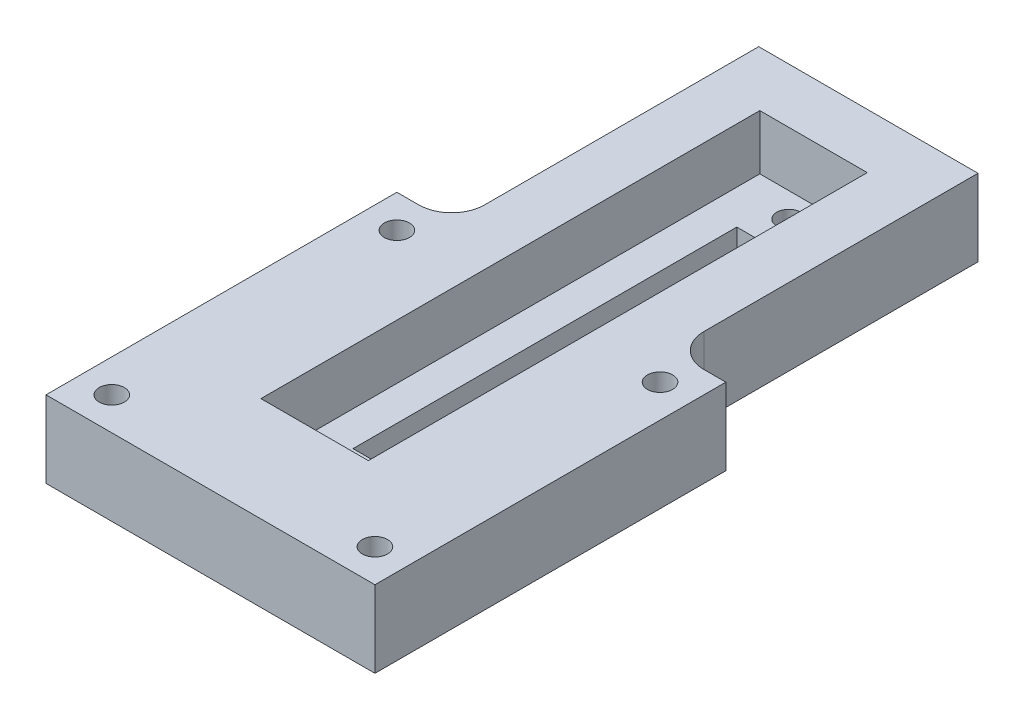
ISO-10303-21;
HEADER;
FILE_DESCRIPTION(('STEP AP214'),'2;1');
FILE_NAME('part.step','',(''),(''),'','','');
FILE_SCHEMA(('AUTOMOTIVE_DESIGN { 1 0 10303 214 1 1 1 1 }'));
ENDSEC;
DATA;
#1=APPLICATION_CONTEXT('core data for automotive mechanical design processes');
#2=APPLICATION_PROTOCOL_DEFINITION('international standard','automotive_design',2000,#1);
#3=PRODUCT_CONTEXT('',#1,'mechanical');
#4=PRODUCT('Part','Part','',(#3));
#5=PRODUCT_RELATED_PRODUCT_CATEGORY('part','',(#4));
#6=PRODUCT_DEFINITION_FORMATION('','',#4);
#7=PRODUCT_DEFINITION_CONTEXT('part definition',#1,'design');
#8=PRODUCT_DEFINITION('design','',#6,#7);
#9=PRODUCT_DEFINITION_SHAPE('','',#8);
#10=(LENGTH_UNIT() NAMED_UNIT(*) SI_UNIT(.MILLI.,.METRE.));
#11=(NAMED_UNIT(*) PLANE_ANGLE_UNIT() SI_UNIT($,.RADIAN.));
#12=(NAMED_UNIT(*) SI_UNIT($,.STERADIAN.) SOLID_ANGLE_UNIT());
#13=UNCERTAINTY_MEASURE_WITH_UNIT(LENGTH_MEASURE(1.E-05),#10,'distance_accuracy_value','');
#14=(GEOMETRIC_REPRESENTATION_CONTEXT(3) GLOBAL_UNCERTAINTY_ASSIGNED_CONTEXT((#13)) GLOBAL_UNIT_ASSIGNED_CONTEXT((#10,
#11,#12)) REPRESENTATION_CONTEXT('',''));
#15=CARTESIAN_POINT('',(0.,0.,0.));
#16=DIRECTION('',(0.,0.,1.));
#17=DIRECTION('',(1.,0.,0.));
#18=AXIS2_PLACEMENT_3D('',#15,#16,#17);
#19=CARTESIAN_POINT('',(0.,0.,18.25));
#20=DIRECTION('',(0.,1.,0.));
#21=DIRECTION('',(0.,0.,1.));
#22=AXIS2_PLACEMENT_3D('',#19,#20,#21);
#23=CYLINDRICAL_SURFACE('',#22,1.1);
#24=CARTESIAN_POINT('',(0.,2.,18.25));
#25=DIRECTION('',(0.,1.,0.));
#26=DIRECTION('',(0.,0.,-1.));
#27=AXIS2_PLACEMENT_3D('',#24,#25,#26);
#28=CIRCLE('',#27,1.1);
#29=CARTESIAN_POINT('',(0.,2.,17.15));
#30=VERTEX_POINT('',#29);
#31=EDGE_CURVE('E193',#30,#30,#28,.T.);
#32=ORIENTED_EDGE('',*,*,#31,.T.);
#33=EDGE_LOOP('',(#32));
#34=FACE_BOUND('',#33,.T.);
#35=CARTESIAN_POINT('',(0.,1.,18.25));
#36=DIRECTION('',(0.,-1.,0.));
#37=DIRECTION('',(0.,0.,-1.));
#38=AXIS2_PLACEMENT_3D('',#35,#36,#37);
#39=CIRCLE('',#38,1.1);
#40=CARTESIAN_POINT('',(0.,1.,17.15));
#41=VERTEX_POINT('',#40);
#42=EDGE_CURVE('E39',#41,#41,#39,.F.);
#43=ORIENTED_EDGE('',*,*,#42,.F.);
#44=EDGE_LOOP('',(#43));
#45=FACE_BOUND('',#44,.T.);
#46=ADVANCED_FACE('F35',(#34,#45),#23,.F.);
#47=CARTESIAN_POINT('',(0.,0.,-22.75));
#48=DIRECTION('',(0.,1.,0.));
#49=DIRECTION('',(0.,0.,1.));
#50=AXIS2_PLACEMENT_3D('',#47,#48,#49);
#51=CYLINDRICAL_SURFACE('',#50,1.1);
#52=CARTESIAN_POINT('',(0.,2.,-22.75));
#53=DIRECTION('',(0.,1.,0.));
#54=DIRECTION('',(0.,0.,1.));
#55=AXIS2_PLACEMENT_3D('',#52,#53,#54);
#56=CIRCLE('',#55,1.1);
#57=CARTESIAN_POINT('',(0.,2.,-21.65));
#58=VERTEX_POINT('',#57);
#59=EDGE_CURVE('E200',#58,#58,#56,.T.);
#60=ORIENTED_EDGE('',*,*,#59,.T.);
#61=EDGE_LOOP('',(#60));
#62=FACE_BOUND('',#61,.T.);
#63=CARTESIAN_POINT('',(0.,1.,-22.75));
#64=DIRECTION('',(0.,-1.,0.));
#65=DIRECTION('',(0.,0.,-1.));
#66=AXIS2_PLACEMENT_3D('',#63,#64,#65);
#67=CIRCLE('',#66,1.1);
#68=CARTESIAN_POINT('',(0.,1.,-23.85));
#69=VERTEX_POINT('',#68);
#70=EDGE_CURVE('E306',#69,#69,#67,.F.);
#71=ORIENTED_EDGE('',*,*,#70,.F.);
#72=EDGE_LOOP('',(#71));
#73=FACE_BOUND('',#72,.T.);
#74=ADVANCED_FACE('F361',(#62,#73),#51,.F.);
#75=CARTESIAN_POINT('',(0.,2.,0.));
#76=DIRECTION('',(0.,-1.,0.));
#77=DIRECTION('',(0.,0.,-1.));
#78=AXIS2_PLACEMENT_3D('',#75,#76,#77);
#79=PLANE('',#78);
#80=ORIENTED_EDGE('',*,*,#59,.F.);
#81=EDGE_LOOP('',(#80));
#82=FACE_BOUND('',#81,.T.);
#83=ORIENTED_EDGE('',*,*,#31,.F.);
#84=EDGE_LOOP('',(#83));
#85=FACE_BOUND('',#84,.T.);
#86=DIRECTION('',(0.,0.,-1.));
#87=VECTOR('',#86,1.);
#88=CARTESIAN_POINT('',(4.9,2.,20.5));
#89=LINE('',#88,#87);
#90=CARTESIAN_POINT('',(4.9,2.,20.5));
#91=VERTEX_POINT('',#90);
#92=CARTESIAN_POINT('',(4.9,2.,-25.));
#93=VERTEX_POINT('',#92);
#94=EDGE_CURVE('E210',#91,#93,#89,.T.);
#95=ORIENTED_EDGE('',*,*,#94,.T.);
#96=DIRECTION('',(-1.,0.,0.));
#97=VECTOR('',#96,1.);
#98=CARTESIAN_POINT('',(-4.9,2.,-25.));
#99=LINE('',#98,#97);
#100=CARTESIAN_POINT('',(-4.9,2.,-25.));
#101=VERTEX_POINT('',#100);
#102=EDGE_CURVE('E213',#93,#101,#99,.T.);
#103=ORIENTED_EDGE('',*,*,#102,.T.);
#104=DIRECTION('',(0.,0.,1.));
#105=VECTOR('',#104,1.);
#106=CARTESIAN_POINT('',(-4.9,2.,20.5));
#107=LINE('',#106,#105);
#108=CARTESIAN_POINT('',(-4.9,2.,20.5));
#109=VERTEX_POINT('',#108);
#110=EDGE_CURVE('E217',#101,#109,#107,.T.);
#111=ORIENTED_EDGE('',*,*,#110,.T.);
#112=DIRECTION('',(1.,0.,0.));
#113=VECTOR('',#112,1.);
#114=CARTESIAN_POINT('',(-4.9,2.,20.5));
#115=LINE('',#114,#113);
#116=EDGE_CURVE('E220',#109,#91,#115,.T.);
#117=ORIENTED_EDGE('',*,*,#116,.T.);
#118=EDGE_LOOP('',(#95,#103,#111,#117));
#119=FACE_BOUND('',#118,.T.);
#120=DIRECTION('',(0.,0.,-1.));
#121=VECTOR('',#120,1.);
#122=CARTESIAN_POINT('',(1.75,2.,15.25));
#123=LINE('',#122,#121);
#124=CARTESIAN_POINT('',(1.75,2.,15.25));
#125=VERTEX_POINT('',#124);
#126=CARTESIAN_POINT('',(1.75,2.,-19.75));
#127=VERTEX_POINT('',#126);
#128=EDGE_CURVE('E169',#125,#127,#123,.T.);
#129=ORIENTED_EDGE('',*,*,#128,.F.);
#130=DIRECTION('',(1.,0.,0.));
#131=VECTOR('',#130,1.);
#132=CARTESIAN_POINT('',(-1.75,2.,15.25));
#133=LINE('',#132,#131);
#134=CARTESIAN_POINT('',(-1.75,2.,15.25));
#135=VERTEX_POINT('',#134);
#136=EDGE_CURVE('E187',#135,#125,#133,.T.);
#137=ORIENTED_EDGE('',*,*,#136,.F.);
#138=DIRECTION('',(0.,0.,1.));
#139=VECTOR('',#138,1.);
#140=CARTESIAN_POINT('',(-1.75,2.,15.25));
#141=LINE('',#140,#139);
#142=CARTESIAN_POINT('',(-1.75,2.,-19.75));
#143=VERTEX_POINT('',#142);
#144=EDGE_CURVE('E190',#143,#135,#141,.T.);
#145=ORIENTED_EDGE('',*,*,#144,.F.);
#146=DIRECTION('',(-1.,0.,0.));
#147=VECTOR('',#146,1.);
#148=CARTESIAN_POINT('',(-1.75,2.,-19.75));
#149=LINE('',#148,#147);
#150=EDGE_CURVE('E199',#127,#143,#149,.T.);
#151=ORIENTED_EDGE('',*,*,#150,.F.);
#152=EDGE_LOOP('',(#129,#137,#145,#151));
#153=FACE_BOUND('',#152,.T.);
#154=ADVANCED_FACE('F357',(#82,#85,#119,#153),#79,.F.);
#155=CARTESIAN_POINT('',(10.,7.,30.));
#156=DIRECTION('',(-1.,0.,0.));
#157=DIRECTION('',(0.,0.,1.));
#158=AXIS2_PLACEMENT_3D('',#155,#156,#157);
#159=PLANE('',#158);
#160=DIRECTION('',(0.,0.,-1.));
#161=VECTOR('',#160,1.);
#162=CARTESIAN_POINT('',(10.,7.,30.));
#163=LINE('',#162,#161);
#164=CARTESIAN_POINT('',(10.,7.,-5.));
#165=VERTEX_POINT('',#164);
#166=CARTESIAN_POINT('',(10.,7.,-30.));
#167=VERTEX_POINT('',#166);
#168=EDGE_CURVE('E271',#165,#167,#163,.T.);
#169=ORIENTED_EDGE('',*,*,#168,.F.);
#170=DIRECTION('',(0.,-1.,0.));
#171=VECTOR('',#170,1.);
#172=CARTESIAN_POINT('',(10.,7.,-5.));
#173=LINE('',#172,#171);
#174=CARTESIAN_POINT('',(10.,0.,-5.));
#175=VERTEX_POINT('',#174);
#176=EDGE_CURVE('E293',#165,#175,#173,.T.);
#177=ORIENTED_EDGE('',*,*,#176,.T.);
#178=DIRECTION('',(0.,0.,-1.));
#179=VECTOR('',#178,1.);
#180=CARTESIAN_POINT('',(10.,0.,30.));
#181=LINE('',#180,#179);
#182=CARTESIAN_POINT('',(10.,0.,-30.));
#183=VERTEX_POINT('',#182);
#184=EDGE_CURVE('E263',#175,#183,#181,.T.);
#185=ORIENTED_EDGE('',*,*,#184,.T.);
#186=DIRECTION('',(0.,-1.,0.));
#187=VECTOR('',#186,1.);
#188=CARTESIAN_POINT('',(10.,7.,-30.));
#189=LINE('',#188,#187);
#190=EDGE_CURVE('E290',#167,#183,#189,.T.);
#191=ORIENTED_EDGE('',*,*,#190,.F.);
#192=EDGE_LOOP('',(#169,#177,#185,#191));
#193=FACE_BOUND('',#192,.T.);
#194=ADVANCED_FACE('F360',(#193),#159,.F.);
#195=CARTESIAN_POINT('',(-10.,7.,-30.));
#196=DIRECTION('',(0.,0.,1.));
#197=DIRECTION('',(1.,0.,0.));
#198=AXIS2_PLACEMENT_3D('',#195,#196,#197);
#199=PLANE('',#198);
#200=DIRECTION('',(-1.,0.,0.));
#201=VECTOR('',#200,1.);
#202=CARTESIAN_POINT('',(-10.,0.,-30.));
#203=LINE('',#202,#201);
#204=CARTESIAN_POINT('',(-10.,0.,-30.));
#205=VERTEX_POINT('',#204);
#206=EDGE_CURVE('E282',#183,#205,#203,.T.);
#207=ORIENTED_EDGE('',*,*,#206,.T.);
#208=DIRECTION('',(0.,-1.,0.));
#209=VECTOR('',#208,1.);
#210=CARTESIAN_POINT('',(-10.,7.,-30.));
#211=LINE('',#210,#209);
#212=CARTESIAN_POINT('',(-10.,7.,-30.));
#213=VERTEX_POINT('',#212);
#214=EDGE_CURVE('E280',#213,#205,#211,.T.);
#215=ORIENTED_EDGE('',*,*,#214,.F.);
#216=DIRECTION('',(-1.,0.,0.));
#217=VECTOR('',#216,1.);
#218=CARTESIAN_POINT('',(-10.,7.,-30.));
#219=LINE('',#218,#217);
#220=EDGE_CURVE('E273',#167,#213,#219,.T.);
#221=ORIENTED_EDGE('',*,*,#220,.F.);
#222=ORIENTED_EDGE('',*,*,#190,.T.);
#223=EDGE_LOOP('',(#207,#215,#221,#222));
#224=FACE_BOUND('',#223,.T.);
#225=ADVANCED_FACE('F624',(#224),#199,.F.);
#226=CARTESIAN_POINT('',(-10.,7.,30.));
#227=DIRECTION('',(1.,0.,0.));
#228=DIRECTION('',(0.,0.,-1.));
#229=AXIS2_PLACEMENT_3D('',#226,#227,#228);
#230=PLANE('',#229);
#231=DIRECTION('',(0.,0.,1.));
#232=VECTOR('',#231,1.);
#233=CARTESIAN_POINT('',(-10.,0.,30.));
#234=LINE('',#233,#232);
#235=CARTESIAN_POINT('',(-10.,0.,-5.));
#236=VERTEX_POINT('',#235);
#237=EDGE_CURVE('E284',#205,#236,#234,.T.);
#238=ORIENTED_EDGE('',*,*,#237,.T.);
#239=DIRECTION('',(0.,1.,0.));
#240=VECTOR('',#239,1.);
#241=CARTESIAN_POINT('',(-10.,7.,-5.));
#242=LINE('',#241,#240);
#243=CARTESIAN_POINT('',(-10.,7.,-5.));
#244=VERTEX_POINT('',#243);
#245=EDGE_CURVE('E298',#236,#244,#242,.T.);
#246=ORIENTED_EDGE('',*,*,#245,.T.);
#247=DIRECTION('',(0.,0.,1.));
#248=VECTOR('',#247,1.);
#249=CARTESIAN_POINT('',(-10.,7.,30.));
#250=LINE('',#249,#248);
#251=EDGE_CURVE('E276',#213,#244,#250,.T.);
#252=ORIENTED_EDGE('',*,*,#251,.F.);
#253=ORIENTED_EDGE('',*,*,#214,.T.);
#254=EDGE_LOOP('',(#238,#246,#252,#253));
#255=FACE_BOUND('',#254,.T.);
#256=ADVANCED_FACE('F614',(#255),#230,.F.);
#257=CARTESIAN_POINT('',(-10.,7.,30.));
#258=DIRECTION('',(0.,0.,-1.));
#259=DIRECTION('',(-1.,0.,0.));
#260=AXIS2_PLACEMENT_3D('',#257,#258,#259);
#261=PLANE('',#260);
#262=DIRECTION('',(1.,0.,0.));
#263=VECTOR('',#262,1.);
#264=CARTESIAN_POINT('',(-10.,0.,30.));
#265=LINE('',#264,#263);
#266=CARTESIAN_POINT('',(-15.,0.,30.));
#267=VERTEX_POINT('',#266);
#268=CARTESIAN_POINT('',(15.,0.,30.));
#269=VERTEX_POINT('',#268);
#270=EDGE_CURVE('E274',#267,#269,#265,.T.);
#271=ORIENTED_EDGE('',*,*,#270,.T.);
#272=DIRECTION('',(0.,-1.,0.));
#273=VECTOR('',#272,1.);
#274=CARTESIAN_POINT('',(15.,7.,30.));
#275=LINE('',#274,#273);
#276=CARTESIAN_POINT('',(15.,7.,30.));
#277=VERTEX_POINT('',#276);
#278=EDGE_CURVE('E264',#277,#269,#275,.T.);
#279=ORIENTED_EDGE('',*,*,#278,.F.);
#280=DIRECTION('',(1.,0.,0.));
#281=VECTOR('',#280,1.);
#282=CARTESIAN_POINT('',(-10.,7.,30.));
#283=LINE('',#282,#281);
#284=CARTESIAN_POINT('',(-15.,7.,30.));
#285=VERTEX_POINT('',#284);
#286=EDGE_CURVE('E278',#285,#277,#283,.T.);
#287=ORIENTED_EDGE('',*,*,#286,.F.);
#288=DIRECTION('',(0.,-1.,0.));
#289=VECTOR('',#288,1.);
#290=CARTESIAN_POINT('',(-15.,7.,30.));
#291=LINE('',#290,#289);
#292=EDGE_CURVE('E260',#285,#267,#291,.T.);
#293=ORIENTED_EDGE('',*,*,#292,.T.);
#294=EDGE_LOOP('',(#271,#279,#287,#293));
#295=FACE_BOUND('',#294,.T.);
#296=ADVANCED_FACE('F603',(#295),#261,.F.);
#297=CARTESIAN_POINT('',(0.,7.,0.));
#298=DIRECTION('',(0.,-1.,0.));
#299=DIRECTION('',(0.,0.,-1.));
#300=AXIS2_PLACEMENT_3D('',#297,#298,#299);
#301=PLANE('',#300);
#302=CARTESIAN_POINT('',(12.,7.,0.999999999999991));
#303=DIRECTION('',(0.,1.,0.));
#304=DIRECTION('',(0.,0.,-1.));
#305=AXIS2_PLACEMENT_3D('',#302,#303,#304);
#306=CIRCLE('',#305,1.15);
#307=CARTESIAN_POINT('',(12.,7.,-0.150000000000009));
#308=VERTEX_POINT('',#307);
#309=EDGE_CURVE('E312',#308,#308,#306,.T.);
#310=ORIENTED_EDGE('',*,*,#309,.F.);
#311=EDGE_LOOP('',(#310));
#312=FACE_BOUND('',#311,.T.);
#313=CARTESIAN_POINT('',(-12.,7.,27.));
#314=DIRECTION('',(0.,1.,0.));
#315=DIRECTION('',(0.,0.,-1.));
#316=AXIS2_PLACEMENT_3D('',#313,#314,#315);
#317=CIRCLE('',#316,1.15);
#318=CARTESIAN_POINT('',(-12.,7.,25.85));
#319=VERTEX_POINT('',#318);
#320=EDGE_CURVE('E337',#319,#319,#317,.T.);
#321=ORIENTED_EDGE('',*,*,#320,.F.);
#322=EDGE_LOOP('',(#321));
#323=FACE_BOUND('',#322,.T.);
#324=CARTESIAN_POINT('',(12.,7.,27.));
#325=DIRECTION('',(0.,1.,0.));
#326=DIRECTION('',(0.,0.,1.));
#327=AXIS2_PLACEMENT_3D('',#324,#325,#326);
#328=CIRCLE('',#327,1.15);
#329=CARTESIAN_POINT('',(12.,7.,28.15));
#330=VERTEX_POINT('',#329);
#331=EDGE_CURVE('E331',#330,#330,#328,.T.);
#332=ORIENTED_EDGE('',*,*,#331,.F.);
#333=EDGE_LOOP('',(#332));
#334=FACE_BOUND('',#333,.T.);
#335=CARTESIAN_POINT('',(-12.,7.,0.999999999999994));
#336=DIRECTION('',(0.,1.,0.));
#337=DIRECTION('',(0.,0.,1.));
#338=AXIS2_PLACEMENT_3D('',#335,#336,#337);
#339=CIRCLE('',#338,1.15);
#340=CARTESIAN_POINT('',(-12.,7.,2.14999999999999));
#341=VERTEX_POINT('',#340);
#342=EDGE_CURVE('E330',#341,#341,#339,.T.);
#343=ORIENTED_EDGE('',*,*,#342,.F.);
#344=EDGE_LOOP('',(#343));
#345=FACE_BOUND('',#344,.T.);
#346=DIRECTION('',(-1.,0.,0.));
#347=VECTOR('',#346,1.);
#348=CARTESIAN_POINT('',(-4.9,7.,-25.));
#349=LINE('',#348,#347);
#350=CARTESIAN_POINT('',(4.9,7.,-25.));
#351=VERTEX_POINT('',#350);
#352=CARTESIAN_POINT('',(-4.9,7.,-25.));
#353=VERTEX_POINT('',#352);
#354=EDGE_CURVE('E225',#351,#353,#349,.T.);
#355=ORIENTED_EDGE('',*,*,#354,.F.);
#356=DIRECTION('',(0.,0.,-1.));
#357=VECTOR('',#356,1.);
#358=CARTESIAN_POINT('',(4.9,7.,20.5));
#359=LINE('',#358,#357);
#360=CARTESIAN_POINT('',(4.9,7.,20.5));
#361=VERTEX_POINT('',#360);
#362=EDGE_CURVE('E205',#361,#351,#359,.T.);
#363=ORIENTED_EDGE('',*,*,#362,.F.);
#364=DIRECTION('',(1.,0.,0.));
#365=VECTOR('',#364,1.);
#366=CARTESIAN_POINT('',(-4.9,7.,20.5));
#367=LINE('',#366,#365);
#368=CARTESIAN_POINT('',(-4.9,7.,20.5));
#369=VERTEX_POINT('',#368);
#370=EDGE_CURVE('E214',#369,#361,#367,.T.);
#371=ORIENTED_EDGE('',*,*,#370,.F.);
#372=DIRECTION('',(0.,0.,1.));
#373=VECTOR('',#372,1.);
#374=CARTESIAN_POINT('',(-4.9,7.,20.5));
#375=LINE('',#374,#373);
#376=EDGE_CURVE('E228',#353,#369,#375,.T.);
#377=ORIENTED_EDGE('',*,*,#376,.F.);
#378=EDGE_LOOP('',(#355,#363,#371,#377));
#379=FACE_BOUND('',#378,.T.);
#380=ORIENTED_EDGE('',*,*,#251,.T.);
#381=CARTESIAN_POINT('',(-13.,7.,-5.));
#382=DIRECTION('',(0.,-1.,0.));
#383=DIRECTION('',(0.,0.,-1.));
#384=AXIS2_PLACEMENT_3D('',#381,#382,#383);
#385=CIRCLE('',#384,3.);
#386=CARTESIAN_POINT('',(-13.,7.,-2.));
#387=VERTEX_POINT('',#386);
#388=EDGE_CURVE('E44',#244,#387,#385,.T.);
#389=ORIENTED_EDGE('',*,*,#388,.T.);
#390=DIRECTION('',(1.,0.,0.));
#391=VECTOR('',#390,1.);
#392=CARTESIAN_POINT('',(15.,7.,-2.));
#393=LINE('',#392,#391);
#394=CARTESIAN_POINT('',(-15.,7.,-2.00000000000001));
#395=VERTEX_POINT('',#394);
#396=EDGE_CURVE('E247',#395,#387,#393,.T.);
#397=ORIENTED_EDGE('',*,*,#396,.F.);
#398=DIRECTION('',(0.,0.,-1.));
#399=VECTOR('',#398,1.);
#400=CARTESIAN_POINT('',(-15.,7.,30.));
#401=LINE('',#400,#399);
#402=EDGE_CURVE('E242',#285,#395,#401,.T.);
#403=ORIENTED_EDGE('',*,*,#402,.F.);
#404=ORIENTED_EDGE('',*,*,#286,.T.);
#405=DIRECTION('',(0.,0.,1.));
#406=VECTOR('',#405,1.);
#407=CARTESIAN_POINT('',(15.,7.,30.));
#408=LINE('',#407,#406);
#409=CARTESIAN_POINT('',(15.,7.,-2.));
#410=VERTEX_POINT('',#409);
#411=EDGE_CURVE('E249',#410,#277,#408,.T.);
#412=ORIENTED_EDGE('',*,*,#411,.F.);
#413=CARTESIAN_POINT('',(13.,7.,-2.));
#414=VERTEX_POINT('',#413);
#415=EDGE_CURVE('E245',#414,#410,#393,.T.);
#416=ORIENTED_EDGE('',*,*,#415,.F.);
#417=CARTESIAN_POINT('',(13.,7.,-5.));
#418=DIRECTION('',(0.,-1.,0.));
#419=DIRECTION('',(0.,0.,-1.));
#420=AXIS2_PLACEMENT_3D('',#417,#418,#419);
#421=CIRCLE('',#420,3.);
#422=EDGE_CURVE('E304',#414,#165,#421,.T.);
#423=ORIENTED_EDGE('',*,*,#422,.T.);
#424=ORIENTED_EDGE('',*,*,#168,.T.);
#425=ORIENTED_EDGE('',*,*,#220,.T.);
#426=EDGE_LOOP('',(#380,#389,#397,#403,#404,#412,#416,#423,#424,#425));
#427=FACE_BOUND('',#426,.T.);
#428=ADVANCED_FACE('F592',(#312,#323,#334,#345,#379,#427),#301,.F.);
#429=CARTESIAN_POINT('',(0.,0.,0.));
#430=DIRECTION('',(0.,-1.,0.));
#431=DIRECTION('',(0.,0.,-1.));
#432=AXIS2_PLACEMENT_3D('',#429,#430,#431);
#433=PLANE('',#432);
#434=CARTESIAN_POINT('',(0.,0.,18.25));
#435=DIRECTION('',(0.,-1.,0.));
#436=DIRECTION('',(0.,0.,-1.));
#437=AXIS2_PLACEMENT_3D('',#434,#435,#436);
#438=CIRCLE('',#437,1.95);
#439=CARTESIAN_POINT('',(0.,0.,16.3));
#440=VERTEX_POINT('',#439);
#441=EDGE_CURVE('E314',#440,#440,#438,.T.);
#442=ORIENTED_EDGE('',*,*,#441,.F.);
#443=EDGE_LOOP('',(#442));
#444=FACE_BOUND('',#443,.T.);
#445=CARTESIAN_POINT('',(0.,0.,-22.75));
#446=DIRECTION('',(0.,-1.,0.));
#447=DIRECTION('',(0.,0.,-1.));
#448=AXIS2_PLACEMENT_3D('',#445,#446,#447);
#449=CIRCLE('',#448,1.95);
#450=CARTESIAN_POINT('',(0.,0.,-24.7));
#451=VERTEX_POINT('',#450);
#452=EDGE_CURVE('E324',#451,#451,#449,.T.);
#453=ORIENTED_EDGE('',*,*,#452,.F.);
#454=EDGE_LOOP('',(#453));
#455=FACE_BOUND('',#454,.T.);
#456=CARTESIAN_POINT('',(12.,0.,0.999999999999991));
#457=DIRECTION('',(0.,1.,0.));
#458=DIRECTION('',(0.,0.,-1.));
#459=AXIS2_PLACEMENT_3D('',#456,#457,#458);
#460=CIRCLE('',#459,1.15);
#461=CARTESIAN_POINT('',(12.,0.,-0.150000000000009));
#462=VERTEX_POINT('',#461);
#463=EDGE_CURVE('E340',#462,#462,#460,.T.);
#464=ORIENTED_EDGE('',*,*,#463,.T.);
#465=EDGE_LOOP('',(#464));
#466=FACE_BOUND('',#465,.T.);
#467=CARTESIAN_POINT('',(-12.,0.,27.));
#468=DIRECTION('',(0.,1.,0.));
#469=DIRECTION('',(0.,0.,-1.));
#470=AXIS2_PLACEMENT_3D('',#467,#468,#469);
#471=CIRCLE('',#470,1.15);
#472=CARTESIAN_POINT('',(-12.,0.,25.85));
#473=VERTEX_POINT('',#472);
#474=EDGE_CURVE('E334',#473,#473,#471,.T.);
#475=ORIENTED_EDGE('',*,*,#474,.T.);
#476=EDGE_LOOP('',(#475));
#477=FACE_BOUND('',#476,.T.);
#478=CARTESIAN_POINT('',(12.,0.,27.));
#479=DIRECTION('',(0.,1.,0.));
#480=DIRECTION('',(0.,0.,1.));
#481=AXIS2_PLACEMENT_3D('',#478,#479,#480);
#482=CIRCLE('',#481,1.15);
#483=CARTESIAN_POINT('',(12.,0.,28.15));
#484=VERTEX_POINT('',#483);
#485=EDGE_CURVE('E327',#484,#484,#482,.T.);
#486=ORIENTED_EDGE('',*,*,#485,.T.);
#487=EDGE_LOOP('',(#486));
#488=FACE_BOUND('',#487,.T.);
#489=CARTESIAN_POINT('',(-12.,0.,0.999999999999994));
#490=DIRECTION('',(0.,1.,0.));
#491=DIRECTION('',(0.,0.,1.));
#492=AXIS2_PLACEMENT_3D('',#489,#490,#491);
#493=CIRCLE('',#492,1.15);
#494=CARTESIAN_POINT('',(-12.,0.,2.14999999999999));
#495=VERTEX_POINT('',#494);
#496=EDGE_CURVE('E345',#495,#495,#493,.T.);
#497=ORIENTED_EDGE('',*,*,#496,.T.);
#498=EDGE_LOOP('',(#497));
#499=FACE_BOUND('',#498,.T.);
#500=DIRECTION('',(0.,0.,-1.));
#501=VECTOR('',#500,1.);
#502=CARTESIAN_POINT('',(1.75,0.,15.25));
#503=LINE('',#502,#501);
#504=CARTESIAN_POINT('',(1.75,0.,15.25));
#505=VERTEX_POINT('',#504);
#506=CARTESIAN_POINT('',(1.75,0.,-19.75));
#507=VERTEX_POINT('',#506);
#508=EDGE_CURVE('E166',#505,#507,#503,.T.);
#509=ORIENTED_EDGE('',*,*,#508,.T.);
#510=DIRECTION('',(-1.,0.,0.));
#511=VECTOR('',#510,1.);
#512=CARTESIAN_POINT('',(-1.75,0.,-19.75));
#513=LINE('',#512,#511);
#514=CARTESIAN_POINT('',(-1.75,0.,-19.75));
#515=VERTEX_POINT('',#514);
#516=EDGE_CURVE('E178',#507,#515,#513,.T.);
#517=ORIENTED_EDGE('',*,*,#516,.T.);
#518=DIRECTION('',(0.,0.,1.));
#519=VECTOR('',#518,1.);
#520=CARTESIAN_POINT('',(-1.75,0.,15.25));
#521=LINE('',#520,#519);
#522=CARTESIAN_POINT('',(-1.75,0.,15.25));
#523=VERTEX_POINT('',#522);
#524=EDGE_CURVE('E182',#515,#523,#521,.T.);
#525=ORIENTED_EDGE('',*,*,#524,.T.);
#526=DIRECTION('',(1.,0.,0.));
#527=VECTOR('',#526,1.);
#528=CARTESIAN_POINT('',(-1.75,0.,15.25));
#529=LINE('',#528,#527);
#530=EDGE_CURVE('E174',#523,#505,#529,.T.);
#531=ORIENTED_EDGE('',*,*,#530,.T.);
#532=EDGE_LOOP('',(#509,#517,#525,#531));
#533=FACE_BOUND('',#532,.T.);
#534=ORIENTED_EDGE('',*,*,#184,.F.);
#535=CARTESIAN_POINT('',(13.,0.,-5.));
#536=DIRECTION('',(0.,-1.,0.));
#537=DIRECTION('',(0.,0.,-1.));
#538=AXIS2_PLACEMENT_3D('',#535,#536,#537);
#539=CIRCLE('',#538,3.);
#540=CARTESIAN_POINT('',(13.,0.,-2.));
#541=VERTEX_POINT('',#540);
#542=EDGE_CURVE('E302',#175,#541,#539,.F.);
#543=ORIENTED_EDGE('',*,*,#542,.T.);
#544=DIRECTION('',(1.,0.,0.));
#545=VECTOR('',#544,1.);
#546=CARTESIAN_POINT('',(15.,0.,-2.));
#547=LINE('',#546,#545);
#548=CARTESIAN_POINT('',(15.,0.,-2.));
#549=VERTEX_POINT('',#548);
#550=EDGE_CURVE('E255',#541,#549,#547,.T.);
#551=ORIENTED_EDGE('',*,*,#550,.T.);
#552=DIRECTION('',(0.,0.,1.));
#553=VECTOR('',#552,1.);
#554=CARTESIAN_POINT('',(15.,0.,30.));
#555=LINE('',#554,#553);
#556=EDGE_CURVE('E246',#549,#269,#555,.T.);
#557=ORIENTED_EDGE('',*,*,#556,.T.);
#558=ORIENTED_EDGE('',*,*,#270,.F.);
#559=DIRECTION('',(0.,0.,-1.));
#560=VECTOR('',#559,1.);
#561=CARTESIAN_POINT('',(-15.,0.,30.));
#562=LINE('',#561,#560);
#563=CARTESIAN_POINT('',(-15.,0.,-2.00000000000001));
#564=VERTEX_POINT('',#563);
#565=EDGE_CURVE('E235',#267,#564,#562,.T.);
#566=ORIENTED_EDGE('',*,*,#565,.T.);
#567=CARTESIAN_POINT('',(-13.,0.,-2.));
#568=VERTEX_POINT('',#567);
#569=EDGE_CURVE('E256',#564,#568,#547,.T.);
#570=ORIENTED_EDGE('',*,*,#569,.T.);
#571=CARTESIAN_POINT('',(-13.,0.,-5.));
#572=DIRECTION('',(0.,-1.,0.));
#573=DIRECTION('',(0.,0.,-1.));
#574=AXIS2_PLACEMENT_3D('',#571,#572,#573);
#575=CIRCLE('',#574,3.);
#576=EDGE_CURVE('E11',#568,#236,#575,.F.);
#577=ORIENTED_EDGE('',*,*,#576,.T.);
#578=ORIENTED_EDGE('',*,*,#237,.F.);
#579=ORIENTED_EDGE('',*,*,#206,.F.);
#580=EDGE_LOOP('',(#534,#543,#551,#557,#558,#566,#570,#577,#578,#579));
#581=FACE_BOUND('',#580,.T.);
#582=ADVANCED_FACE('F184',(#444,#455,#466,#477,#488,#499,#533,#581),#433,.T.);
#583=CARTESIAN_POINT('',(-15.,7.,30.));
#584=DIRECTION('',(-1.,0.,0.));
#585=DIRECTION('',(0.,0.,1.));
#586=AXIS2_PLACEMENT_3D('',#583,#584,#585);
#587=PLANE('',#586);
#588=ORIENTED_EDGE('',*,*,#565,.F.);
#589=ORIENTED_EDGE('',*,*,#292,.F.);
#590=ORIENTED_EDGE('',*,*,#402,.T.);
#591=DIRECTION('',(0.,-1.,0.));
#592=VECTOR('',#591,1.);
#593=CARTESIAN_POINT('',(-15.,7.,-2.00000000000001));
#594=LINE('',#593,#592);
#595=EDGE_CURVE('E252',#395,#564,#594,.T.);
#596=ORIENTED_EDGE('',*,*,#595,.T.);
#597=EDGE_LOOP('',(#588,#589,#590,#596));
#598=FACE_BOUND('',#597,.T.);
#599=ADVANCED_FACE('F576',(#598),#587,.T.);
#600=CARTESIAN_POINT('',(15.,7.,-2.));
#601=DIRECTION('',(0.,0.,-1.));
#602=DIRECTION('',(-1.,0.,0.));
#603=AXIS2_PLACEMENT_3D('',#600,#601,#602);
#604=PLANE('',#603);
#605=ORIENTED_EDGE('',*,*,#396,.T.);
#606=DIRECTION('',(0.,1.,0.));
#607=VECTOR('',#606,1.);
#608=CARTESIAN_POINT('',(-13.,7.,-2.));
#609=LINE('',#608,#607);
#610=EDGE_CURVE('E58',#387,#568,#609,.F.);
#611=ORIENTED_EDGE('',*,*,#610,.T.);
#612=ORIENTED_EDGE('',*,*,#569,.F.);
#613=ORIENTED_EDGE('',*,*,#595,.F.);
#614=EDGE_LOOP('',(#605,#611,#612,#613));
#615=FACE_BOUND('',#614,.T.);
#616=ADVANCED_FACE('F567',(#615),#604,.T.);
#617=ORIENTED_EDGE('',*,*,#550,.F.);
#618=DIRECTION('',(0.,-1.,0.));
#619=VECTOR('',#618,1.);
#620=CARTESIAN_POINT('',(13.,7.,-2.));
#621=LINE('',#620,#619);
#622=EDGE_CURVE('E296',#541,#414,#621,.F.);
#623=ORIENTED_EDGE('',*,*,#622,.T.);
#624=ORIENTED_EDGE('',*,*,#415,.T.);
#625=DIRECTION('',(0.,-1.,0.));
#626=VECTOR('',#625,1.);
#627=CARTESIAN_POINT('',(15.,7.,-2.));
#628=LINE('',#627,#626);
#629=EDGE_CURVE('E267',#410,#549,#628,.T.);
#630=ORIENTED_EDGE('',*,*,#629,.T.);
#631=EDGE_LOOP('',(#617,#623,#624,#630));
#632=FACE_BOUND('',#631,.T.);
#633=ADVANCED_FACE('F558',(#632),#604,.T.);
#634=CARTESIAN_POINT('',(15.,7.,30.));
#635=DIRECTION('',(1.,0.,0.));
#636=DIRECTION('',(0.,0.,-1.));
#637=AXIS2_PLACEMENT_3D('',#634,#635,#636);
#638=PLANE('',#637);
#639=ORIENTED_EDGE('',*,*,#556,.F.);
#640=ORIENTED_EDGE('',*,*,#629,.F.);
#641=ORIENTED_EDGE('',*,*,#411,.T.);
#642=ORIENTED_EDGE('',*,*,#278,.T.);
#643=EDGE_LOOP('',(#639,#640,#641,#642));
#644=FACE_BOUND('',#643,.T.);
#645=ADVANCED_FACE('F549',(#644),#638,.T.);
#646=CARTESIAN_POINT('',(4.9,2.,20.5));
#647=DIRECTION('',(1.,0.,0.));
#648=DIRECTION('',(0.,0.,-1.));
#649=AXIS2_PLACEMENT_3D('',#646,#647,#648);
#650=PLANE('',#649);
#651=ORIENTED_EDGE('',*,*,#362,.T.);
#652=DIRECTION('',(0.,1.,0.));
#653=VECTOR('',#652,1.);
#654=CARTESIAN_POINT('',(4.9,2.,-25.));
#655=LINE('',#654,#653);
#656=EDGE_CURVE('E223',#93,#351,#655,.T.);
#657=ORIENTED_EDGE('',*,*,#656,.F.);
#658=ORIENTED_EDGE('',*,*,#94,.F.);
#659=DIRECTION('',(0.,1.,0.));
#660=VECTOR('',#659,1.);
#661=CARTESIAN_POINT('',(4.9,2.,20.5));
#662=LINE('',#661,#660);
#663=EDGE_CURVE('E233',#91,#361,#662,.T.);
#664=ORIENTED_EDGE('',*,*,#663,.T.);
#665=EDGE_LOOP('',(#651,#657,#658,#664));
#666=FACE_BOUND('',#665,.T.);
#667=ADVANCED_FACE('F540',(#666),#650,.F.);
#668=CARTESIAN_POINT('',(-4.9,2.,20.5));
#669=DIRECTION('',(0.,0.,1.));
#670=DIRECTION('',(1.,0.,0.));
#671=AXIS2_PLACEMENT_3D('',#668,#669,#670);
#672=PLANE('',#671);
#673=ORIENTED_EDGE('',*,*,#370,.T.);
#674=ORIENTED_EDGE('',*,*,#663,.F.);
#675=ORIENTED_EDGE('',*,*,#116,.F.);
#676=DIRECTION('',(0.,1.,0.));
#677=VECTOR('',#676,1.);
#678=CARTESIAN_POINT('',(-4.9,2.,20.5));
#679=LINE('',#678,#677);
#680=EDGE_CURVE('E236',#109,#369,#679,.T.);
#681=ORIENTED_EDGE('',*,*,#680,.T.);
#682=EDGE_LOOP('',(#673,#674,#675,#681));
#683=FACE_BOUND('',#682,.T.);
#684=ADVANCED_FACE('F531',(#683),#672,.F.);
#685=CARTESIAN_POINT('',(-4.9,2.,20.5));
#686=DIRECTION('',(-1.,0.,0.));
#687=DIRECTION('',(0.,0.,1.));
#688=AXIS2_PLACEMENT_3D('',#685,#686,#687);
#689=PLANE('',#688);
#690=ORIENTED_EDGE('',*,*,#376,.T.);
#691=ORIENTED_EDGE('',*,*,#680,.F.);
#692=ORIENTED_EDGE('',*,*,#110,.F.);
#693=DIRECTION('',(0.,1.,0.));
#694=VECTOR('',#693,1.);
#695=CARTESIAN_POINT('',(-4.9,2.,-25.));
#696=LINE('',#695,#694);
#697=EDGE_CURVE('E238',#101,#353,#696,.T.);
#698=ORIENTED_EDGE('',*,*,#697,.T.);
#699=EDGE_LOOP('',(#690,#691,#692,#698));
#700=FACE_BOUND('',#699,.T.);
#701=ADVANCED_FACE('F522',(#700),#689,.F.);
#702=CARTESIAN_POINT('',(-4.9,2.,-25.));
#703=DIRECTION('',(0.,0.,-1.));
#704=DIRECTION('',(-1.,0.,0.));
#705=AXIS2_PLACEMENT_3D('',#702,#703,#704);
#706=PLANE('',#705);
#707=ORIENTED_EDGE('',*,*,#354,.T.);
#708=ORIENTED_EDGE('',*,*,#697,.F.);
#709=ORIENTED_EDGE('',*,*,#102,.F.);
#710=ORIENTED_EDGE('',*,*,#656,.T.);
#711=EDGE_LOOP('',(#707,#708,#709,#710));
#712=FACE_BOUND('',#711,.T.);
#713=ADVANCED_FACE('F379',(#712),#706,.F.);
#714=CARTESIAN_POINT('',(1.75,0.,15.25));
#715=DIRECTION('',(1.,0.,0.));
#716=DIRECTION('',(0.,0.,-1.));
#717=AXIS2_PLACEMENT_3D('',#714,#715,#716);
#718=PLANE('',#717);
#719=ORIENTED_EDGE('',*,*,#128,.T.);
#720=DIRECTION('',(0.,1.,0.));
#721=VECTOR('',#720,1.);
#722=CARTESIAN_POINT('',(1.75,0.,-19.75));
#723=LINE('',#722,#721);
#724=EDGE_CURVE('E162',#507,#127,#723,.T.);
#725=ORIENTED_EDGE('',*,*,#724,.F.);
#726=ORIENTED_EDGE('',*,*,#508,.F.);
#727=DIRECTION('',(0.,1.,0.));
#728=VECTOR('',#727,1.);
#729=CARTESIAN_POINT('',(1.75,0.,15.25));
#730=LINE('',#729,#728);
#731=EDGE_CURVE('E203',#505,#125,#730,.T.);
#732=ORIENTED_EDGE('',*,*,#731,.T.);
#733=EDGE_LOOP('',(#719,#725,#726,#732));
#734=FACE_BOUND('',#733,.T.);
#735=ADVANCED_FACE('F164',(#734),#718,.F.);
#736=CARTESIAN_POINT('',(-1.75,0.,15.25));
#737=DIRECTION('',(0.,0.,1.));
#738=DIRECTION('',(1.,0.,0.));
#739=AXIS2_PLACEMENT_3D('',#736,#737,#738);
#740=PLANE('',#739);
#741=ORIENTED_EDGE('',*,*,#136,.T.);
#742=ORIENTED_EDGE('',*,*,#731,.F.);
#743=ORIENTED_EDGE('',*,*,#530,.F.);
#744=DIRECTION('',(0.,1.,0.));
#745=VECTOR('',#744,1.);
#746=CARTESIAN_POINT('',(-1.75,0.,15.25));
#747=LINE('',#746,#745);
#748=EDGE_CURVE('E206',#523,#135,#747,.T.);
#749=ORIENTED_EDGE('',*,*,#748,.T.);
#750=EDGE_LOOP('',(#741,#742,#743,#749));
#751=FACE_BOUND('',#750,.T.);
#752=ADVANCED_FACE('F371',(#751),#740,.F.);
#753=CARTESIAN_POINT('',(-1.75,0.,15.25));
#754=DIRECTION('',(-1.,0.,0.));
#755=DIRECTION('',(0.,0.,1.));
#756=AXIS2_PLACEMENT_3D('',#753,#754,#755);
#757=PLANE('',#756);
#758=ORIENTED_EDGE('',*,*,#144,.T.);
#759=ORIENTED_EDGE('',*,*,#748,.F.);
#760=ORIENTED_EDGE('',*,*,#524,.F.);
#761=DIRECTION('',(0.,1.,0.));
#762=VECTOR('',#761,1.);
#763=CARTESIAN_POINT('',(-1.75,0.,-19.75));
#764=LINE('',#763,#762);
#765=EDGE_CURVE('E173',#515,#143,#764,.T.);
#766=ORIENTED_EDGE('',*,*,#765,.T.);
#767=EDGE_LOOP('',(#758,#759,#760,#766));
#768=FACE_BOUND('',#767,.T.);
#769=ADVANCED_FACE('F369',(#768),#757,.F.);
#770=CARTESIAN_POINT('',(-1.75,0.,-19.75));
#771=DIRECTION('',(0.,0.,-1.));
#772=DIRECTION('',(-1.,0.,0.));
#773=AXIS2_PLACEMENT_3D('',#770,#771,#772);
#774=PLANE('',#773);
#775=ORIENTED_EDGE('',*,*,#150,.T.);
#776=ORIENTED_EDGE('',*,*,#765,.F.);
#777=ORIENTED_EDGE('',*,*,#516,.F.);
#778=ORIENTED_EDGE('',*,*,#724,.T.);
#779=EDGE_LOOP('',(#775,#776,#777,#778));
#780=FACE_BOUND('',#779,.T.);
#781=ADVANCED_FACE('F179',(#780),#774,.F.);
#782=CARTESIAN_POINT('',(-12.,0.,0.999999999999994));
#783=DIRECTION('',(0.,1.,0.));
#784=DIRECTION('',(0.,0.,1.));
#785=AXIS2_PLACEMENT_3D('',#782,#783,#784);
#786=CYLINDRICAL_SURFACE('',#785,1.15);
#787=ORIENTED_EDGE('',*,*,#496,.F.);
#788=EDGE_LOOP('',(#787));
#789=FACE_BOUND('',#788,.T.);
#790=ORIENTED_EDGE('',*,*,#342,.T.);
#791=EDGE_LOOP('',(#790));
#792=FACE_BOUND('',#791,.T.);
#793=ADVANCED_FACE('F388',(#789,#792),#786,.F.);
#794=CARTESIAN_POINT('',(12.,0.,27.));
#795=DIRECTION('',(0.,1.,0.));
#796=DIRECTION('',(0.,0.,1.));
#797=AXIS2_PLACEMENT_3D('',#794,#795,#796);
#798=CYLINDRICAL_SURFACE('',#797,1.15);
#799=ORIENTED_EDGE('',*,*,#485,.F.);
#800=EDGE_LOOP('',(#799));
#801=FACE_BOUND('',#800,.T.);
#802=ORIENTED_EDGE('',*,*,#331,.T.);
#803=EDGE_LOOP('',(#802));
#804=FACE_BOUND('',#803,.T.);
#805=ADVANCED_FACE('F391',(#801,#804),#798,.F.);
#806=CARTESIAN_POINT('',(-12.,0.,27.));
#807=DIRECTION('',(0.,1.,0.));
#808=DIRECTION('',(0.,0.,1.));
#809=AXIS2_PLACEMENT_3D('',#806,#807,#808);
#810=CYLINDRICAL_SURFACE('',#809,1.15);
#811=ORIENTED_EDGE('',*,*,#474,.F.);
#812=EDGE_LOOP('',(#811));
#813=FACE_BOUND('',#812,.T.);
#814=ORIENTED_EDGE('',*,*,#320,.T.);
#815=EDGE_LOOP('',(#814));
#816=FACE_BOUND('',#815,.T.);
#817=ADVANCED_FACE('F397',(#813,#816),#810,.F.);
#818=CARTESIAN_POINT('',(12.,0.,0.999999999999991));
#819=DIRECTION('',(0.,1.,0.));
#820=DIRECTION('',(0.,0.,1.));
#821=AXIS2_PLACEMENT_3D('',#818,#819,#820);
#822=CYLINDRICAL_SURFACE('',#821,1.15);
#823=ORIENTED_EDGE('',*,*,#463,.F.);
#824=EDGE_LOOP('',(#823));
#825=FACE_BOUND('',#824,.T.);
#826=ORIENTED_EDGE('',*,*,#309,.T.);
#827=EDGE_LOOP('',(#826));
#828=FACE_BOUND('',#827,.T.);
#829=ADVANCED_FACE('F393',(#825,#828),#822,.F.);
#830=CARTESIAN_POINT('',(13.,7.,-5.));
#831=DIRECTION('',(0.,-1.,0.));
#832=DIRECTION('',(0.,0.,-1.));
#833=AXIS2_PLACEMENT_3D('',#830,#831,#832);
#834=CYLINDRICAL_SURFACE('',#833,3.);
#835=ORIENTED_EDGE('',*,*,#422,.F.);
#836=ORIENTED_EDGE('',*,*,#622,.F.);
#837=ORIENTED_EDGE('',*,*,#542,.F.);
#838=ORIENTED_EDGE('',*,*,#176,.F.);
#839=EDGE_LOOP('',(#835,#836,#837,#838));
#840=FACE_BOUND('',#839,.T.);
#841=ADVANCED_FACE('F396',(#840),#834,.F.);
#842=CARTESIAN_POINT('',(-13.,7.,-5.));
#843=DIRECTION('',(0.,1.,0.));
#844=DIRECTION('',(0.,0.,1.));
#845=AXIS2_PLACEMENT_3D('',#842,#843,#844);
#846=CYLINDRICAL_SURFACE('',#845,3.);
#847=ORIENTED_EDGE('',*,*,#576,.F.);
#848=ORIENTED_EDGE('',*,*,#610,.F.);
#849=ORIENTED_EDGE('',*,*,#388,.F.);
#850=ORIENTED_EDGE('',*,*,#245,.F.);
#851=EDGE_LOOP('',(#847,#848,#849,#850));
#852=FACE_BOUND('',#851,.T.);
#853=ADVANCED_FACE('F37',(#852),#846,.F.);
#854=CARTESIAN_POINT('',(0.,1.,-22.75));
#855=DIRECTION('',(0.,-1.,0.));
#856=DIRECTION('',(0.,0.,-1.));
#857=AXIS2_PLACEMENT_3D('',#854,#855,#856);
#858=PLANE('',#857);
#859=CARTESIAN_POINT('',(0.,1.,-22.75));
#860=DIRECTION('',(0.,-1.,0.));
#861=DIRECTION('',(0.,0.,-1.));
#862=AXIS2_PLACEMENT_3D('',#859,#860,#861);
#863=CIRCLE('',#862,1.95);
#864=CARTESIAN_POINT('',(0.,1.,-24.7));
#865=VERTEX_POINT('',#864);
#866=EDGE_CURVE('E319',#865,#865,#863,.T.);
#867=ORIENTED_EDGE('',*,*,#866,.T.);
#868=EDGE_LOOP('',(#867));
#869=FACE_BOUND('',#868,.T.);
#870=ORIENTED_EDGE('',*,*,#70,.T.);
#871=EDGE_LOOP('',(#870));
#872=FACE_BOUND('',#871,.T.);
#873=ADVANCED_FACE('F409',(#869,#872),#858,.T.);
#874=CARTESIAN_POINT('',(0.,1.,-22.75));
#875=DIRECTION('',(0.,-1.,0.));
#876=DIRECTION('',(0.,0.,-1.));
#877=AXIS2_PLACEMENT_3D('',#874,#875,#876);
#878=CYLINDRICAL_SURFACE('',#877,1.95);
#879=ORIENTED_EDGE('',*,*,#866,.F.);
#880=EDGE_LOOP('',(#879));
#881=FACE_BOUND('',#880,.T.);
#882=ORIENTED_EDGE('',*,*,#452,.T.);
#883=EDGE_LOOP('',(#882));
#884=FACE_BOUND('',#883,.T.);
#885=ADVANCED_FACE('F405',(#881,#884),#878,.F.);
#886=CARTESIAN_POINT('',(0.,1.,18.25));
#887=DIRECTION('',(0.,-1.,0.));
#888=DIRECTION('',(0.,0.,-1.));
#889=AXIS2_PLACEMENT_3D('',#886,#887,#888);
#890=PLANE('',#889);
#891=CARTESIAN_POINT('',(0.,1.,18.25));
#892=DIRECTION('',(0.,-1.,0.));
#893=DIRECTION('',(0.,0.,-1.));
#894=AXIS2_PLACEMENT_3D('',#891,#892,#893);
#895=CIRCLE('',#894,1.95);
#896=CARTESIAN_POINT('',(0.,1.,16.3));
#897=VERTEX_POINT('',#896);
#898=EDGE_CURVE('E308',#897,#897,#895,.T.);
#899=ORIENTED_EDGE('',*,*,#898,.T.);
#900=EDGE_LOOP('',(#899));
#901=FACE_BOUND('',#900,.T.);
#902=ORIENTED_EDGE('',*,*,#42,.T.);
#903=EDGE_LOOP('',(#902));
#904=FACE_BOUND('',#903,.T.);
#905=ADVANCED_FACE('F408',(#901,#904),#890,.T.);
#906=CARTESIAN_POINT('',(0.,1.,18.25));
#907=DIRECTION('',(0.,-1.,0.));
#908=DIRECTION('',(0.,0.,-1.));
#909=AXIS2_PLACEMENT_3D('',#906,#907,#908);
#910=CYLINDRICAL_SURFACE('',#909,1.95);
#911=ORIENTED_EDGE('',*,*,#898,.F.);
#912=EDGE_LOOP('',(#911));
#913=FACE_BOUND('',#912,.T.);
#914=ORIENTED_EDGE('',*,*,#441,.T.);
#915=EDGE_LOOP('',(#914));
#916=FACE_BOUND('',#915,.T.);
#917=ADVANCED_FACE('F414',(#913,#916),#910,.F.);
#918=CLOSED_SHELL('',(#46,#74,#154,#194,#225,#256,#296,#428,#582,#599,#616,#633,#645,#667,#684,
#701,#713,#735,#752,#769,#781,#793,#805,#817,#829,#841,#853,#873,#885,#905,#917));
#919=MANIFOLD_SOLID_BREP('B2',#918);
#920=ADVANCED_BREP_SHAPE_REPRESENTATION('',(#18,#919),#14);
#921=SHAPE_DEFINITION_REPRESENTATION(#9,#920);
ENDSEC;
END-ISO-10303-21;
